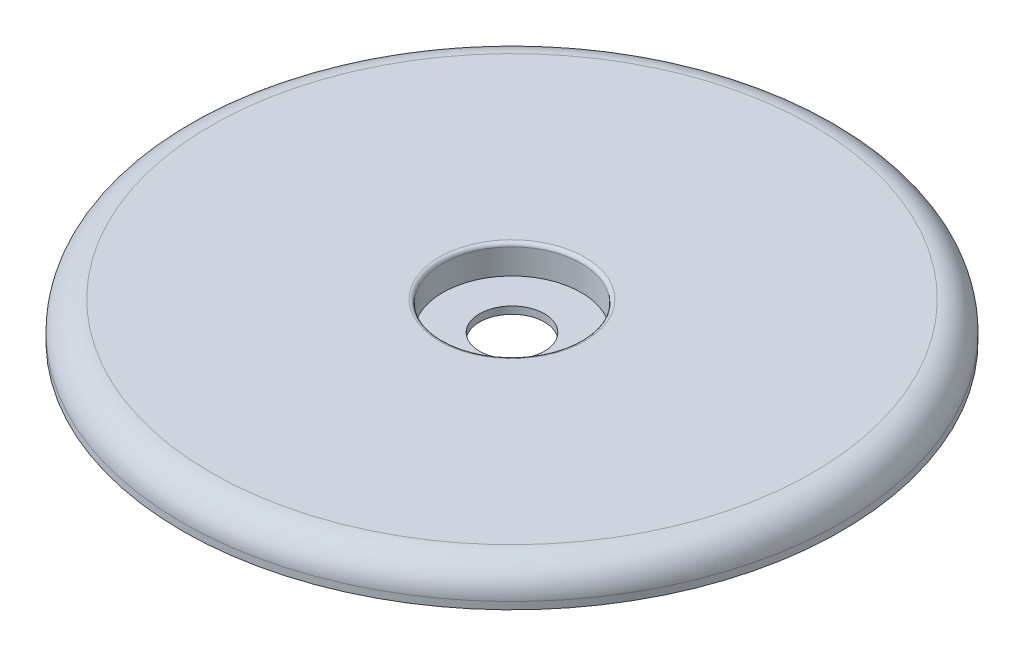
ISO-10303-21;
HEADER;
FILE_DESCRIPTION(('STEP AP214'),'2;1');
FILE_NAME('part.step','',(''),(''),'','','');
FILE_SCHEMA(('AUTOMOTIVE_DESIGN { 1 0 10303 214 1 1 1 1 }'));
ENDSEC;
DATA;
#1=APPLICATION_CONTEXT('core data for automotive mechanical design processes');
#2=APPLICATION_PROTOCOL_DEFINITION('international standard','automotive_design',2000,#1);
#3=PRODUCT_CONTEXT('',#1,'mechanical');
#4=PRODUCT('Part','Part','',(#3));
#5=PRODUCT_RELATED_PRODUCT_CATEGORY('part','',(#4));
#6=PRODUCT_DEFINITION_FORMATION('','',#4);
#7=PRODUCT_DEFINITION_CONTEXT('part definition',#1,'design');
#8=PRODUCT_DEFINITION('design','',#6,#7);
#9=PRODUCT_DEFINITION_SHAPE('','',#8);
#10=(LENGTH_UNIT() NAMED_UNIT(*) SI_UNIT(.MILLI.,.METRE.));
#11=(NAMED_UNIT(*) PLANE_ANGLE_UNIT() SI_UNIT($,.RADIAN.));
#12=(NAMED_UNIT(*) SI_UNIT($,.STERADIAN.) SOLID_ANGLE_UNIT());
#13=UNCERTAINTY_MEASURE_WITH_UNIT(LENGTH_MEASURE(1.E-05),#10,'distance_accuracy_value','');
#14=(GEOMETRIC_REPRESENTATION_CONTEXT(3) GLOBAL_UNCERTAINTY_ASSIGNED_CONTEXT((#13)) GLOBAL_UNIT_ASSIGNED_CONTEXT((#10,
#11,#12)) REPRESENTATION_CONTEXT('',''));
#15=CARTESIAN_POINT('',(0.,0.,0.));
#16=DIRECTION('',(0.,0.,1.));
#17=DIRECTION('',(1.,0.,0.));
#18=AXIS2_PLACEMENT_3D('',#15,#16,#17);
#19=CARTESIAN_POINT('',(0.,5.,0.));
#20=DIRECTION('',(0.,-1.,0.));
#21=DIRECTION('',(0.,0.,-1.));
#22=AXIS2_PLACEMENT_3D('',#19,#20,#21);
#23=CYLINDRICAL_SURFACE('',#22,45.72);
#24=CARTESIAN_POINT('',(0.,1.,0.));
#25=DIRECTION('',(0.,1.,0.));
#26=DIRECTION('',(0.,0.,1.));
#27=AXIS2_PLACEMENT_3D('',#24,#25,#26);
#28=CIRCLE('',#27,45.72);
#29=CARTESIAN_POINT('',(0.,1.,45.72));
#30=VERTEX_POINT('',#29);
#31=EDGE_CURVE('E57',#30,#30,#28,.F.);
#32=ORIENTED_EDGE('',*,*,#31,.T.);
#33=EDGE_LOOP('',(#32));
#34=FACE_BOUND('',#33,.T.);
#35=CARTESIAN_POINT('',(0.,0.,0.));
#36=DIRECTION('',(0.,1.,0.));
#37=DIRECTION('',(0.,0.,1.));
#38=AXIS2_PLACEMENT_3D('',#35,#36,#37);
#39=CIRCLE('',#38,45.72);
#40=CARTESIAN_POINT('',(0.,0.,45.72));
#41=VERTEX_POINT('',#40);
#42=EDGE_CURVE('E66',#41,#41,#39,.T.);
#43=ORIENTED_EDGE('',*,*,#42,.T.);
#44=EDGE_LOOP('',(#43));
#45=FACE_BOUND('',#44,.T.);
#46=ADVANCED_FACE('F43',(#34,#45),#23,.T.);
#47=CARTESIAN_POINT('',(0.,5.,0.));
#48=DIRECTION('',(0.,1.,0.));
#49=DIRECTION('',(0.,0.,1.));
#50=AXIS2_PLACEMENT_3D('',#47,#48,#49);
#51=PLANE('',#50);
#52=CARTESIAN_POINT('',(0.,5.,0.));
#53=DIRECTION('',(0.,1.,0.));
#54=DIRECTION('',(0.,0.,1.));
#55=AXIS2_PLACEMENT_3D('',#52,#53,#54);
#56=CIRCLE('',#55,10.1);
#57=CARTESIAN_POINT('',(0.,5.,10.1));
#58=VERTEX_POINT('',#57);
#59=EDGE_CURVE('E10',#58,#58,#56,.F.);
#60=ORIENTED_EDGE('',*,*,#59,.T.);
#61=EDGE_LOOP('',(#60));
#62=FACE_BOUND('',#61,.T.);
#63=CARTESIAN_POINT('',(0.,5.,0.));
#64=DIRECTION('',(0.,1.,0.));
#65=DIRECTION('',(0.,0.,1.));
#66=AXIS2_PLACEMENT_3D('',#63,#64,#65);
#67=CIRCLE('',#66,41.72);
#68=CARTESIAN_POINT('',(0.,5.,41.72));
#69=VERTEX_POINT('',#68);
#70=EDGE_CURVE('E62',#69,#69,#67,.T.);
#71=ORIENTED_EDGE('',*,*,#70,.T.);
#72=EDGE_LOOP('',(#71));
#73=FACE_BOUND('',#72,.T.);
#74=ADVANCED_FACE('F108',(#62,#73),#51,.T.);
#75=CARTESIAN_POINT('',(0.,0.,0.));
#76=DIRECTION('',(0.,1.,0.));
#77=DIRECTION('',(0.,0.,1.));
#78=AXIS2_PLACEMENT_3D('',#75,#76,#77);
#79=PLANE('',#78);
#80=CARTESIAN_POINT('',(0.,0.,0.));
#81=DIRECTION('',(0.,1.,0.));
#82=DIRECTION('',(0.,0.,1.));
#83=AXIS2_PLACEMENT_3D('',#80,#81,#82);
#84=CIRCLE('',#83,4.5);
#85=CARTESIAN_POINT('',(0.,0.,4.5));
#86=VERTEX_POINT('',#85);
#87=EDGE_CURVE('E75',#86,#86,#84,.T.);
#88=ORIENTED_EDGE('',*,*,#87,.T.);
#89=EDGE_LOOP('',(#88));
#90=FACE_BOUND('',#89,.T.);
#91=ORIENTED_EDGE('',*,*,#42,.F.);
#92=EDGE_LOOP('',(#91));
#93=FACE_BOUND('',#92,.T.);
#94=ADVANCED_FACE('F81',(#90,#93),#79,.F.);
#95=CARTESIAN_POINT('',(0.,1.,0.));
#96=DIRECTION('',(0.,1.,0.));
#97=DIRECTION('',(0.,0.,1.));
#98=AXIS2_PLACEMENT_3D('',#95,#96,#97);
#99=CYLINDRICAL_SURFACE('',#98,9.6);
#100=CARTESIAN_POINT('',(0.,4.5,0.));
#101=DIRECTION('',(0.,1.,0.));
#102=DIRECTION('',(0.,0.,1.));
#103=AXIS2_PLACEMENT_3D('',#100,#101,#102);
#104=CIRCLE('',#103,9.6);
#105=CARTESIAN_POINT('',(0.,4.5,9.6));
#106=VERTEX_POINT('',#105);
#107=EDGE_CURVE('E51',#106,#106,#104,.T.);
#108=ORIENTED_EDGE('',*,*,#107,.T.);
#109=EDGE_LOOP('',(#108));
#110=FACE_BOUND('',#109,.T.);
#111=CARTESIAN_POINT('',(0.,1.,0.));
#112=DIRECTION('',(0.,1.,0.));
#113=DIRECTION('',(0.,0.,1.));
#114=AXIS2_PLACEMENT_3D('',#111,#112,#113);
#115=CIRCLE('',#114,9.6);
#116=CARTESIAN_POINT('',(0.,1.,9.6));
#117=VERTEX_POINT('',#116);
#118=EDGE_CURVE('E71',#117,#117,#115,.T.);
#119=ORIENTED_EDGE('',*,*,#118,.F.);
#120=EDGE_LOOP('',(#119));
#121=FACE_BOUND('',#120,.T.);
#122=ADVANCED_FACE('F97',(#110,#121),#99,.F.);
#123=CARTESIAN_POINT('',(0.,1.,0.));
#124=DIRECTION('',(0.,1.,0.));
#125=DIRECTION('',(0.,0.,1.));
#126=AXIS2_PLACEMENT_3D('',#123,#124,#125);
#127=PLANE('',#126);
#128=CARTESIAN_POINT('',(0.,1.,0.));
#129=DIRECTION('',(0.,1.,0.));
#130=DIRECTION('',(0.,0.,1.));
#131=AXIS2_PLACEMENT_3D('',#128,#129,#130);
#132=CIRCLE('',#131,4.5);
#133=CARTESIAN_POINT('',(0.,1.,4.5));
#134=VERTEX_POINT('',#133);
#135=EDGE_CURVE('E77',#134,#134,#132,.T.);
#136=ORIENTED_EDGE('',*,*,#135,.F.);
#137=EDGE_LOOP('',(#136));
#138=FACE_BOUND('',#137,.T.);
#139=ORIENTED_EDGE('',*,*,#118,.T.);
#140=EDGE_LOOP('',(#139));
#141=FACE_BOUND('',#140,.T.);
#142=ADVANCED_FACE('F91',(#138,#141),#127,.T.);
#143=CARTESIAN_POINT('',(0.,0.,0.));
#144=DIRECTION('',(0.,1.,0.));
#145=DIRECTION('',(0.,0.,1.));
#146=AXIS2_PLACEMENT_3D('',#143,#144,#145);
#147=CYLINDRICAL_SURFACE('',#146,4.5);
#148=ORIENTED_EDGE('',*,*,#87,.F.);
#149=EDGE_LOOP('',(#148));
#150=FACE_BOUND('',#149,.T.);
#151=ORIENTED_EDGE('',*,*,#135,.T.);
#152=EDGE_LOOP('',(#151));
#153=FACE_BOUND('',#152,.T.);
#154=ADVANCED_FACE('F86',(#150,#153),#147,.F.);
#155=CARTESIAN_POINT('',(0.,1.,0.));
#156=DIRECTION('',(0.,1.,0.));
#157=DIRECTION('',(0.,0.,1.));
#158=AXIS2_PLACEMENT_3D('',#155,#156,#157);
#159=TOROIDAL_SURFACE('',#158,41.72,4.);
#160=ORIENTED_EDGE('',*,*,#31,.F.);
#161=EDGE_LOOP('',(#160));
#162=FACE_BOUND('',#161,.T.);
#163=ORIENTED_EDGE('',*,*,#70,.F.);
#164=EDGE_LOOP('',(#163));
#165=FACE_BOUND('',#164,.T.);
#166=ADVANCED_FACE('F87',(#162,#165),#159,.T.);
#167=CARTESIAN_POINT('',(0.,4.5,0.));
#168=DIRECTION('',(0.,1.,0.));
#169=DIRECTION('',(0.,0.,1.));
#170=AXIS2_PLACEMENT_3D('',#167,#168,#169);
#171=TOROIDAL_SURFACE('',#170,10.1,0.5);
#172=ORIENTED_EDGE('',*,*,#59,.F.);
#173=EDGE_LOOP('',(#172));
#174=FACE_BOUND('',#173,.T.);
#175=ORIENTED_EDGE('',*,*,#107,.F.);
#176=EDGE_LOOP('',(#175));
#177=FACE_BOUND('',#176,.T.);
#178=ADVANCED_FACE('F44',(#174,#177),#171,.T.);
#179=CLOSED_SHELL('',(#46,#74,#94,#122,#142,#154,#166,#178));
#180=MANIFOLD_SOLID_BREP('B2',#179);
#181=ADVANCED_BREP_SHAPE_REPRESENTATION('',(#18,#180),#14);
#182=SHAPE_DEFINITION_REPRESENTATION(#9,#181);
ENDSEC;
END-ISO-10303-21;
